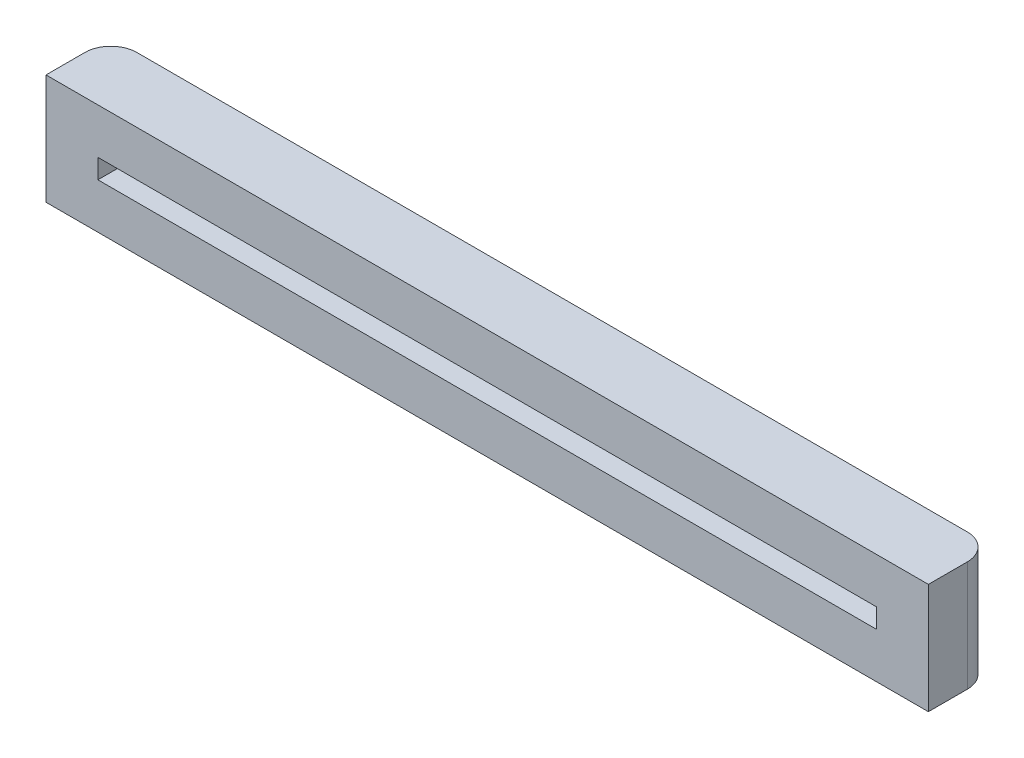
ISO-10303-21;
HEADER;
FILE_DESCRIPTION(('STEP AP214'),'2;1');
FILE_NAME('part.step','',(''),(''),'','','');
FILE_SCHEMA(('AUTOMOTIVE_DESIGN { 1 0 10303 214 1 1 1 1 }'));
ENDSEC;
DATA;
#1=APPLICATION_CONTEXT('core data for automotive mechanical design processes');
#2=APPLICATION_PROTOCOL_DEFINITION('international standard','automotive_design',2000,#1);
#3=PRODUCT_CONTEXT('',#1,'mechanical');
#4=PRODUCT('Part','Part','',(#3));
#5=PRODUCT_RELATED_PRODUCT_CATEGORY('part','',(#4));
#6=PRODUCT_DEFINITION_FORMATION('','',#4);
#7=PRODUCT_DEFINITION_CONTEXT('part definition',#1,'design');
#8=PRODUCT_DEFINITION('design','',#6,#7);
#9=PRODUCT_DEFINITION_SHAPE('','',#8);
#10=(LENGTH_UNIT() NAMED_UNIT(*) SI_UNIT(.MILLI.,.METRE.));
#11=(NAMED_UNIT(*) PLANE_ANGLE_UNIT() SI_UNIT($,.RADIAN.));
#12=(NAMED_UNIT(*) SI_UNIT($,.STERADIAN.) SOLID_ANGLE_UNIT());
#13=UNCERTAINTY_MEASURE_WITH_UNIT(LENGTH_MEASURE(1.E-05),#10,'distance_accuracy_value','');
#14=(GEOMETRIC_REPRESENTATION_CONTEXT(3) GLOBAL_UNCERTAINTY_ASSIGNED_CONTEXT((#13)) GLOBAL_UNIT_ASSIGNED_CONTEXT((#10,
#11,#12)) REPRESENTATION_CONTEXT('',''));
#15=CARTESIAN_POINT('',(0.,0.,0.));
#16=DIRECTION('',(0.,0.,1.));
#17=DIRECTION('',(1.,0.,0.));
#18=AXIS2_PLACEMENT_3D('',#15,#16,#17);
#19=CARTESIAN_POINT('',(0.,0.,5.));
#20=DIRECTION('',(1.,0.,0.));
#21=DIRECTION('',(0.,0.,-1.));
#22=AXIS2_PLACEMENT_3D('',#19,#20,#21);
#23=PLANE('',#22);
#24=DIRECTION('',(0.,0.,-1.));
#25=VECTOR('',#24,1.);
#26=CARTESIAN_POINT('',(0.,8.5,5.));
#27=LINE('',#26,#25);
#28=CARTESIAN_POINT('',(0.,8.5,5.));
#29=VERTEX_POINT('',#28);
#30=CARTESIAN_POINT('',(0.,8.5,2.));
#31=VERTEX_POINT('',#30);
#32=EDGE_CURVE('E188',#29,#31,#27,.T.);
#33=ORIENTED_EDGE('',*,*,#32,.T.);
#34=DIRECTION('',(0.,-1.,0.));
#35=VECTOR('',#34,1.);
#36=CARTESIAN_POINT('',(0.,0.,2.));
#37=LINE('',#36,#35);
#38=CARTESIAN_POINT('',(0.,0.,2.));
#39=VERTEX_POINT('',#38);
#40=EDGE_CURVE('E11',#31,#39,#37,.T.);
#41=ORIENTED_EDGE('',*,*,#40,.T.);
#42=DIRECTION('',(0.,0.,-1.));
#43=VECTOR('',#42,1.);
#44=CARTESIAN_POINT('',(0.,0.,5.));
#45=LINE('',#44,#43);
#46=CARTESIAN_POINT('',(0.,0.,5.));
#47=VERTEX_POINT('',#46);
#48=EDGE_CURVE('E205',#47,#39,#45,.T.);
#49=ORIENTED_EDGE('',*,*,#48,.F.);
#50=DIRECTION('',(0.,-1.,0.));
#51=VECTOR('',#50,1.);
#52=CARTESIAN_POINT('',(0.,0.,5.));
#53=LINE('',#52,#51);
#54=EDGE_CURVE('E174',#29,#47,#53,.T.);
#55=ORIENTED_EDGE('',*,*,#54,.F.);
#56=EDGE_LOOP('',(#33,#41,#49,#55));
#57=FACE_BOUND('',#56,.T.);
#58=ADVANCED_FACE('F39',(#57),#23,.F.);
#59=CARTESIAN_POINT('',(0.,0.,5.));
#60=DIRECTION('',(0.,1.,0.));
#61=DIRECTION('',(0.,0.,1.));
#62=AXIS2_PLACEMENT_3D('',#59,#60,#61);
#63=PLANE('',#62);
#64=DIRECTION('',(1.,0.,0.));
#65=VECTOR('',#64,1.);
#66=CARTESIAN_POINT('',(0.,0.,0.));
#67=LINE('',#66,#65);
#68=CARTESIAN_POINT('',(2.,0.,0.));
#69=VERTEX_POINT('',#68);
#70=CARTESIAN_POINT('',(66.,0.,0.));
#71=VERTEX_POINT('',#70);
#72=EDGE_CURVE('E168',#69,#71,#67,.T.);
#73=ORIENTED_EDGE('',*,*,#72,.T.);
#74=CARTESIAN_POINT('',(66.,0.,2.));
#75=DIRECTION('',(0.,1.,0.));
#76=DIRECTION('',(0.,0.,1.));
#77=AXIS2_PLACEMENT_3D('',#74,#75,#76);
#78=CIRCLE('',#77,2.);
#79=CARTESIAN_POINT('',(68.,0.,2.));
#80=VERTEX_POINT('',#79);
#81=EDGE_CURVE('E48',#71,#80,#78,.F.);
#82=ORIENTED_EDGE('',*,*,#81,.T.);
#83=DIRECTION('',(0.,0.,-1.));
#84=VECTOR('',#83,1.);
#85=CARTESIAN_POINT('',(68.,0.,5.));
#86=LINE('',#85,#84);
#87=CARTESIAN_POINT('',(68.,0.,5.));
#88=VERTEX_POINT('',#87);
#89=EDGE_CURVE('E201',#88,#80,#86,.T.);
#90=ORIENTED_EDGE('',*,*,#89,.F.);
#91=DIRECTION('',(1.,0.,0.));
#92=VECTOR('',#91,1.);
#93=CARTESIAN_POINT('',(0.,0.,5.));
#94=LINE('',#93,#92);
#95=EDGE_CURVE('E178',#47,#88,#94,.T.);
#96=ORIENTED_EDGE('',*,*,#95,.F.);
#97=ORIENTED_EDGE('',*,*,#48,.T.);
#98=CARTESIAN_POINT('',(2.,0.,2.));
#99=DIRECTION('',(0.,1.,0.));
#100=DIRECTION('',(0.,0.,1.));
#101=AXIS2_PLACEMENT_3D('',#98,#99,#100);
#102=CIRCLE('',#101,2.);
#103=EDGE_CURVE('E55',#39,#69,#102,.F.);
#104=ORIENTED_EDGE('',*,*,#103,.T.);
#105=EDGE_LOOP('',(#73,#82,#90,#96,#97,#104));
#106=FACE_BOUND('',#105,.T.);
#107=ADVANCED_FACE('F229',(#106),#63,.F.);
#108=CARTESIAN_POINT('',(68.,0.,5.));
#109=DIRECTION('',(-1.,0.,0.));
#110=DIRECTION('',(0.,0.,1.));
#111=AXIS2_PLACEMENT_3D('',#108,#109,#110);
#112=PLANE('',#111);
#113=ORIENTED_EDGE('',*,*,#89,.T.);
#114=DIRECTION('',(0.,1.,0.));
#115=VECTOR('',#114,1.);
#116=CARTESIAN_POINT('',(68.,8.5,2.));
#117=LINE('',#116,#115);
#118=CARTESIAN_POINT('',(68.,8.5,2.));
#119=VERTEX_POINT('',#118);
#120=EDGE_CURVE('E209',#80,#119,#117,.T.);
#121=ORIENTED_EDGE('',*,*,#120,.T.);
#122=DIRECTION('',(0.,0.,-1.));
#123=VECTOR('',#122,1.);
#124=CARTESIAN_POINT('',(68.,8.5,5.));
#125=LINE('',#124,#123);
#126=CARTESIAN_POINT('',(68.,8.5,5.));
#127=VERTEX_POINT('',#126);
#128=EDGE_CURVE('E197',#127,#119,#125,.T.);
#129=ORIENTED_EDGE('',*,*,#128,.F.);
#130=DIRECTION('',(0.,1.,0.));
#131=VECTOR('',#130,1.);
#132=CARTESIAN_POINT('',(68.,0.,5.));
#133=LINE('',#132,#131);
#134=EDGE_CURVE('E182',#88,#127,#133,.T.);
#135=ORIENTED_EDGE('',*,*,#134,.F.);
#136=EDGE_LOOP('',(#113,#121,#129,#135));
#137=FACE_BOUND('',#136,.T.);
#138=ADVANCED_FACE('F234',(#137),#112,.F.);
#139=CARTESIAN_POINT('',(0.,8.5,5.));
#140=DIRECTION('',(0.,-1.,0.));
#141=DIRECTION('',(0.,0.,-1.));
#142=AXIS2_PLACEMENT_3D('',#139,#140,#141);
#143=PLANE('',#142);
#144=ORIENTED_EDGE('',*,*,#128,.T.);
#145=CARTESIAN_POINT('',(66.,8.5,2.));
#146=DIRECTION('',(0.,-1.,0.));
#147=DIRECTION('',(0.,0.,-1.));
#148=AXIS2_PLACEMENT_3D('',#145,#146,#147);
#149=CIRCLE('',#148,2.);
#150=CARTESIAN_POINT('',(66.,8.5,0.));
#151=VERTEX_POINT('',#150);
#152=EDGE_CURVE('E216',#119,#151,#149,.F.);
#153=ORIENTED_EDGE('',*,*,#152,.T.);
#154=DIRECTION('',(-1.,0.,0.));
#155=VECTOR('',#154,1.);
#156=CARTESIAN_POINT('',(0.,8.5,0.));
#157=LINE('',#156,#155);
#158=CARTESIAN_POINT('',(2.,8.5,0.));
#159=VERTEX_POINT('',#158);
#160=EDGE_CURVE('E179',#151,#159,#157,.T.);
#161=ORIENTED_EDGE('',*,*,#160,.T.);
#162=CARTESIAN_POINT('',(2.,8.5,2.));
#163=DIRECTION('',(0.,-1.,0.));
#164=DIRECTION('',(0.,0.,-1.));
#165=AXIS2_PLACEMENT_3D('',#162,#163,#164);
#166=CIRCLE('',#165,2.);
#167=EDGE_CURVE('E213',#159,#31,#166,.F.);
#168=ORIENTED_EDGE('',*,*,#167,.T.);
#169=ORIENTED_EDGE('',*,*,#32,.F.);
#170=DIRECTION('',(-1.,0.,0.));
#171=VECTOR('',#170,1.);
#172=CARTESIAN_POINT('',(0.,8.5,5.));
#173=LINE('',#172,#171);
#174=EDGE_CURVE('E185',#127,#29,#173,.T.);
#175=ORIENTED_EDGE('',*,*,#174,.F.);
#176=EDGE_LOOP('',(#144,#153,#161,#168,#169,#175));
#177=FACE_BOUND('',#176,.T.);
#178=ADVANCED_FACE('F238',(#177),#143,.F.);
#179=CARTESIAN_POINT('',(0.,0.,5.));
#180=DIRECTION('',(0.,0.,-1.));
#181=DIRECTION('',(-1.,0.,0.));
#182=AXIS2_PLACEMENT_3D('',#179,#180,#181);
#183=PLANE('',#182);
#184=DIRECTION('',(1.,0.,0.));
#185=VECTOR('',#184,1.);
#186=CARTESIAN_POINT('',(4.,3.5,5.));
#187=LINE('',#186,#185);
#188=CARTESIAN_POINT('',(4.,3.5,5.));
#189=VERTEX_POINT('',#188);
#190=CARTESIAN_POINT('',(64.,3.5,5.));
#191=VERTEX_POINT('',#190);
#192=EDGE_CURVE('E159',#189,#191,#187,.T.);
#193=ORIENTED_EDGE('',*,*,#192,.F.);
#194=DIRECTION('',(0.,-1.,0.));
#195=VECTOR('',#194,1.);
#196=CARTESIAN_POINT('',(4.,5.,5.));
#197=LINE('',#196,#195);
#198=CARTESIAN_POINT('',(4.,5.,5.));
#199=VERTEX_POINT('',#198);
#200=EDGE_CURVE('E126',#199,#189,#197,.T.);
#201=ORIENTED_EDGE('',*,*,#200,.F.);
#202=DIRECTION('',(-1.,0.,0.));
#203=VECTOR('',#202,1.);
#204=CARTESIAN_POINT('',(4.,5.,5.));
#205=LINE('',#204,#203);
#206=CARTESIAN_POINT('',(64.,5.,5.));
#207=VERTEX_POINT('',#206);
#208=EDGE_CURVE('E146',#207,#199,#205,.T.);
#209=ORIENTED_EDGE('',*,*,#208,.F.);
#210=DIRECTION('',(0.,1.,0.));
#211=VECTOR('',#210,1.);
#212=CARTESIAN_POINT('',(64.,5.,5.));
#213=LINE('',#212,#211);
#214=EDGE_CURVE('E150',#191,#207,#213,.T.);
#215=ORIENTED_EDGE('',*,*,#214,.F.);
#216=EDGE_LOOP('',(#193,#201,#209,#215));
#217=FACE_BOUND('',#216,.T.);
#218=ORIENTED_EDGE('',*,*,#54,.T.);
#219=ORIENTED_EDGE('',*,*,#95,.T.);
#220=ORIENTED_EDGE('',*,*,#134,.T.);
#221=ORIENTED_EDGE('',*,*,#174,.T.);
#222=EDGE_LOOP('',(#218,#219,#220,#221));
#223=FACE_BOUND('',#222,.T.);
#224=ADVANCED_FACE('F247',(#217,#223),#183,.F.);
#225=CARTESIAN_POINT('',(0.,0.,0.));
#226=DIRECTION('',(0.,0.,-1.));
#227=DIRECTION('',(-1.,0.,0.));
#228=AXIS2_PLACEMENT_3D('',#225,#226,#227);
#229=PLANE('',#228);
#230=ORIENTED_EDGE('',*,*,#160,.F.);
#231=DIRECTION('',(0.,1.,0.));
#232=VECTOR('',#231,1.);
#233=CARTESIAN_POINT('',(66.,0.,0.));
#234=LINE('',#233,#232);
#235=EDGE_CURVE('E62',#151,#71,#234,.F.);
#236=ORIENTED_EDGE('',*,*,#235,.T.);
#237=ORIENTED_EDGE('',*,*,#72,.F.);
#238=DIRECTION('',(0.,-1.,0.));
#239=VECTOR('',#238,1.);
#240=CARTESIAN_POINT('',(2.,8.5,0.));
#241=LINE('',#240,#239);
#242=EDGE_CURVE('E219',#69,#159,#241,.F.);
#243=ORIENTED_EDGE('',*,*,#242,.T.);
#244=EDGE_LOOP('',(#230,#236,#237,#243));
#245=FACE_BOUND('',#244,.T.);
#246=ADVANCED_FACE('F241',(#245),#229,.T.);
#247=CARTESIAN_POINT('',(4.,5.,2.));
#248=DIRECTION('',(-1.,0.,0.));
#249=DIRECTION('',(0.,0.,1.));
#250=AXIS2_PLACEMENT_3D('',#247,#248,#249);
#251=PLANE('',#250);
#252=ORIENTED_EDGE('',*,*,#200,.T.);
#253=DIRECTION('',(0.,0.,1.));
#254=VECTOR('',#253,1.);
#255=CARTESIAN_POINT('',(4.,3.5,2.));
#256=LINE('',#255,#254);
#257=CARTESIAN_POINT('',(4.,3.5,2.));
#258=VERTEX_POINT('',#257);
#259=EDGE_CURVE('E119',#258,#189,#256,.T.);
#260=ORIENTED_EDGE('',*,*,#259,.F.);
#261=DIRECTION('',(0.,-1.,0.));
#262=VECTOR('',#261,1.);
#263=CARTESIAN_POINT('',(4.,5.,2.));
#264=LINE('',#263,#262);
#265=CARTESIAN_POINT('',(4.,5.,2.));
#266=VERTEX_POINT('',#265);
#267=EDGE_CURVE('E123',#266,#258,#264,.T.);
#268=ORIENTED_EDGE('',*,*,#267,.F.);
#269=DIRECTION('',(0.,0.,1.));
#270=VECTOR('',#269,1.);
#271=CARTESIAN_POINT('',(4.,5.,2.));
#272=LINE('',#271,#270);
#273=EDGE_CURVE('E165',#266,#199,#272,.T.);
#274=ORIENTED_EDGE('',*,*,#273,.T.);
#275=EDGE_LOOP('',(#252,#260,#268,#274));
#276=FACE_BOUND('',#275,.T.);
#277=ADVANCED_FACE('F121',(#276),#251,.F.);
#278=CARTESIAN_POINT('',(4.,5.,2.));
#279=DIRECTION('',(0.,1.,0.));
#280=DIRECTION('',(0.,0.,1.));
#281=AXIS2_PLACEMENT_3D('',#278,#279,#280);
#282=PLANE('',#281);
#283=ORIENTED_EDGE('',*,*,#208,.T.);
#284=ORIENTED_EDGE('',*,*,#273,.F.);
#285=DIRECTION('',(-1.,0.,0.));
#286=VECTOR('',#285,1.);
#287=CARTESIAN_POINT('',(4.,5.,2.));
#288=LINE('',#287,#286);
#289=CARTESIAN_POINT('',(64.,5.,2.));
#290=VERTEX_POINT('',#289);
#291=EDGE_CURVE('E132',#290,#266,#288,.T.);
#292=ORIENTED_EDGE('',*,*,#291,.F.);
#293=DIRECTION('',(0.,0.,1.));
#294=VECTOR('',#293,1.);
#295=CARTESIAN_POINT('',(64.,5.,2.));
#296=LINE('',#295,#294);
#297=EDGE_CURVE('E169',#290,#207,#296,.T.);
#298=ORIENTED_EDGE('',*,*,#297,.T.);
#299=EDGE_LOOP('',(#283,#284,#292,#298));
#300=FACE_BOUND('',#299,.T.);
#301=ADVANCED_FACE('F277',(#300),#282,.F.);
#302=CARTESIAN_POINT('',(64.,5.,2.));
#303=DIRECTION('',(1.,0.,0.));
#304=DIRECTION('',(0.,0.,-1.));
#305=AXIS2_PLACEMENT_3D('',#302,#303,#304);
#306=PLANE('',#305);
#307=ORIENTED_EDGE('',*,*,#214,.T.);
#308=ORIENTED_EDGE('',*,*,#297,.F.);
#309=DIRECTION('',(0.,1.,0.));
#310=VECTOR('',#309,1.);
#311=CARTESIAN_POINT('',(64.,5.,2.));
#312=LINE('',#311,#310);
#313=CARTESIAN_POINT('',(64.,3.5,2.));
#314=VERTEX_POINT('',#313);
#315=EDGE_CURVE('E141',#314,#290,#312,.T.);
#316=ORIENTED_EDGE('',*,*,#315,.F.);
#317=DIRECTION('',(0.,0.,1.));
#318=VECTOR('',#317,1.);
#319=CARTESIAN_POINT('',(64.,3.5,2.));
#320=LINE('',#319,#318);
#321=EDGE_CURVE('E131',#314,#191,#320,.T.);
#322=ORIENTED_EDGE('',*,*,#321,.T.);
#323=EDGE_LOOP('',(#307,#308,#316,#322));
#324=FACE_BOUND('',#323,.T.);
#325=ADVANCED_FACE('F274',(#324),#306,.F.);
#326=CARTESIAN_POINT('',(4.,3.5,2.));
#327=DIRECTION('',(0.,-1.,0.));
#328=DIRECTION('',(0.,0.,-1.));
#329=AXIS2_PLACEMENT_3D('',#326,#327,#328);
#330=PLANE('',#329);
#331=ORIENTED_EDGE('',*,*,#192,.T.);
#332=ORIENTED_EDGE('',*,*,#321,.F.);
#333=DIRECTION('',(1.,0.,0.));
#334=VECTOR('',#333,1.);
#335=CARTESIAN_POINT('',(4.,3.5,2.));
#336=LINE('',#335,#334);
#337=EDGE_CURVE('E135',#258,#314,#336,.T.);
#338=ORIENTED_EDGE('',*,*,#337,.F.);
#339=ORIENTED_EDGE('',*,*,#259,.T.);
#340=EDGE_LOOP('',(#331,#332,#338,#339));
#341=FACE_BOUND('',#340,.T.);
#342=ADVANCED_FACE('F136',(#341),#330,.F.);
#343=CARTESIAN_POINT('',(0.,0.,2.));
#344=DIRECTION('',(0.,0.,1.));
#345=DIRECTION('',(1.,0.,0.));
#346=AXIS2_PLACEMENT_3D('',#343,#344,#345);
#347=PLANE('',#346);
#348=ORIENTED_EDGE('',*,*,#267,.T.);
#349=ORIENTED_EDGE('',*,*,#337,.T.);
#350=ORIENTED_EDGE('',*,*,#315,.T.);
#351=ORIENTED_EDGE('',*,*,#291,.T.);
#352=EDGE_LOOP('',(#348,#349,#350,#351));
#353=FACE_BOUND('',#352,.T.);
#354=ADVANCED_FACE('F143',(#353),#347,.T.);
#355=CARTESIAN_POINT('',(66.,0.,2.));
#356=DIRECTION('',(0.,-1.,0.));
#357=DIRECTION('',(0.,0.,-1.));
#358=AXIS2_PLACEMENT_3D('',#355,#356,#357);
#359=CYLINDRICAL_SURFACE('',#358,2.);
#360=ORIENTED_EDGE('',*,*,#81,.F.);
#361=ORIENTED_EDGE('',*,*,#235,.F.);
#362=ORIENTED_EDGE('',*,*,#152,.F.);
#363=ORIENTED_EDGE('',*,*,#120,.F.);
#364=EDGE_LOOP('',(#360,#361,#362,#363));
#365=FACE_BOUND('',#364,.T.);
#366=ADVANCED_FACE('F236',(#365),#359,.T.);
#367=CARTESIAN_POINT('',(2.,0.,2.));
#368=DIRECTION('',(0.,1.,0.));
#369=DIRECTION('',(0.,0.,1.));
#370=AXIS2_PLACEMENT_3D('',#367,#368,#369);
#371=CYLINDRICAL_SURFACE('',#370,2.);
#372=ORIENTED_EDGE('',*,*,#167,.F.);
#373=ORIENTED_EDGE('',*,*,#242,.F.);
#374=ORIENTED_EDGE('',*,*,#103,.F.);
#375=ORIENTED_EDGE('',*,*,#40,.F.);
#376=EDGE_LOOP('',(#372,#373,#374,#375));
#377=FACE_BOUND('',#376,.T.);
#378=ADVANCED_FACE('F41',(#377),#371,.T.);
#379=CLOSED_SHELL('',(#58,#107,#138,#178,#224,#246,#277,#301,#325,#342,#354,#366,#378));
#380=MANIFOLD_SOLID_BREP('B2',#379);
#381=ADVANCED_BREP_SHAPE_REPRESENTATION('',(#18,#380),#14);
#382=SHAPE_DEFINITION_REPRESENTATION(#9,#381);
ENDSEC;
END-ISO-10303-21;
